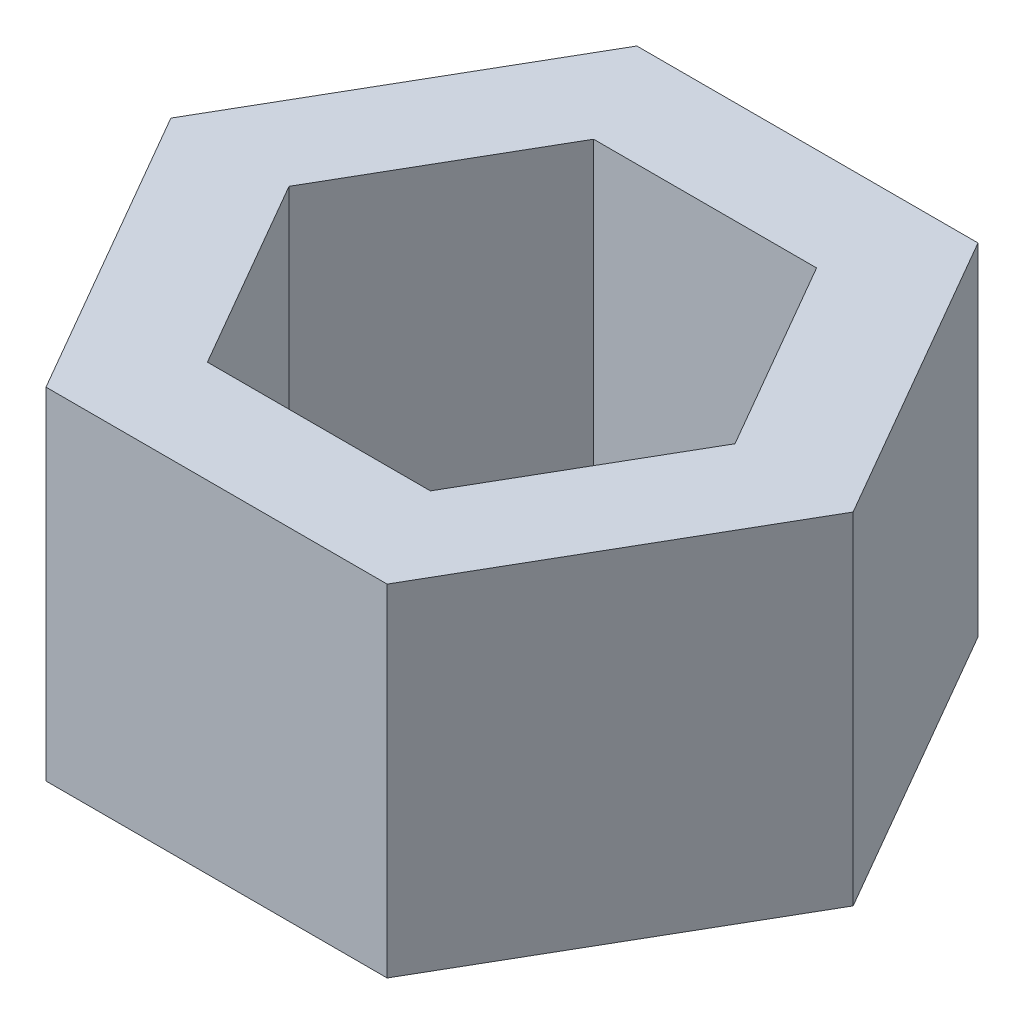
ISO-10303-21;
HEADER;
FILE_DESCRIPTION(('STEP AP214'),'2;1');
FILE_NAME('part.step','',(''),(''),'','','');
FILE_SCHEMA(('AUTOMOTIVE_DESIGN { 1 0 10303 214 1 1 1 1 }'));
ENDSEC;
DATA;
#1=APPLICATION_CONTEXT('core data for automotive mechanical design processes');
#2=APPLICATION_PROTOCOL_DEFINITION('international standard','automotive_design',2000,#1);
#3=PRODUCT_CONTEXT('',#1,'mechanical');
#4=PRODUCT('Part','Part','',(#3));
#5=PRODUCT_RELATED_PRODUCT_CATEGORY('part','',(#4));
#6=PRODUCT_DEFINITION_FORMATION('','',#4);
#7=PRODUCT_DEFINITION_CONTEXT('part definition',#1,'design');
#8=PRODUCT_DEFINITION('design','',#6,#7);
#9=PRODUCT_DEFINITION_SHAPE('','',#8);
#10=(LENGTH_UNIT() NAMED_UNIT(*) SI_UNIT(.MILLI.,.METRE.));
#11=(NAMED_UNIT(*) PLANE_ANGLE_UNIT() SI_UNIT($,.RADIAN.));
#12=(NAMED_UNIT(*) SI_UNIT($,.STERADIAN.) SOLID_ANGLE_UNIT());
#13=UNCERTAINTY_MEASURE_WITH_UNIT(LENGTH_MEASURE(1.E-05),#10,'distance_accuracy_value','');
#14=(GEOMETRIC_REPRESENTATION_CONTEXT(3) GLOBAL_UNCERTAINTY_ASSIGNED_CONTEXT((#13)) GLOBAL_UNIT_ASSIGNED_CONTEXT((#10,
#11,#12)) REPRESENTATION_CONTEXT('',''));
#15=CARTESIAN_POINT('',(0.,0.,0.));
#16=DIRECTION('',(0.,0.,1.));
#17=DIRECTION('',(1.,0.,0.));
#18=AXIS2_PLACEMENT_3D('',#15,#16,#17);
#19=CARTESIAN_POINT('',(-50.,50.,0.));
#20=DIRECTION('',(0.866025403784438,0.,-0.5));
#21=DIRECTION('',(-0.5,0.,-0.866025403784439));
#22=AXIS2_PLACEMENT_3D('',#19,#20,#21);
#23=PLANE('',#22);
#24=DIRECTION('',(0.5,0.,0.866025403784438));
#25=VECTOR('',#24,1.);
#26=CARTESIAN_POINT('',(-50.,0.,0.));
#27=LINE('',#26,#25);
#28=CARTESIAN_POINT('',(-50.,0.,0.));
#29=VERTEX_POINT('',#28);
#30=CARTESIAN_POINT('',(-25.,0.,43.3012701892219));
#31=VERTEX_POINT('',#30);
#32=EDGE_CURVE('E167',#29,#31,#27,.T.);
#33=ORIENTED_EDGE('',*,*,#32,.T.);
#34=DIRECTION('',(0.,-1.,0.));
#35=VECTOR('',#34,1.);
#36=CARTESIAN_POINT('',(-25.,50.,43.3012701892219));
#37=LINE('',#36,#35);
#38=CARTESIAN_POINT('',(-25.,50.,43.3012701892219));
#39=VERTEX_POINT('',#38);
#40=EDGE_CURVE('E11',#39,#31,#37,.T.);
#41=ORIENTED_EDGE('',*,*,#40,.F.);
#42=DIRECTION('',(0.5,0.,0.866025403784438));
#43=VECTOR('',#42,1.);
#44=CARTESIAN_POINT('',(-50.,50.,0.));
#45=LINE('',#44,#43);
#46=CARTESIAN_POINT('',(-50.,50.,0.));
#47=VERTEX_POINT('',#46);
#48=EDGE_CURVE('E175',#47,#39,#45,.T.);
#49=ORIENTED_EDGE('',*,*,#48,.F.);
#50=DIRECTION('',(0.,-1.,0.));
#51=VECTOR('',#50,1.);
#52=CARTESIAN_POINT('',(-50.,50.,0.));
#53=LINE('',#52,#51);
#54=EDGE_CURVE('E189',#47,#29,#53,.T.);
#55=ORIENTED_EDGE('',*,*,#54,.T.);
#56=EDGE_LOOP('',(#33,#41,#49,#55));
#57=FACE_BOUND('',#56,.T.);
#58=ADVANCED_FACE('F34',(#57),#23,.F.);
#59=CARTESIAN_POINT('',(-25.,50.,43.3012701892219));
#60=DIRECTION('',(0.,0.,-1.));
#61=DIRECTION('',(-1.,0.,0.));
#62=AXIS2_PLACEMENT_3D('',#59,#60,#61);
#63=PLANE('',#62);
#64=DIRECTION('',(1.,0.,0.));
#65=VECTOR('',#64,1.);
#66=CARTESIAN_POINT('',(-25.,0.,43.3012701892219));
#67=LINE('',#66,#65);
#68=CARTESIAN_POINT('',(25.,0.,43.3012701892219));
#69=VERTEX_POINT('',#68);
#70=EDGE_CURVE('E192',#31,#69,#67,.T.);
#71=ORIENTED_EDGE('',*,*,#70,.T.);
#72=DIRECTION('',(0.,-1.,0.));
#73=VECTOR('',#72,1.);
#74=CARTESIAN_POINT('',(25.,50.,43.3012701892219));
#75=LINE('',#74,#73);
#76=CARTESIAN_POINT('',(25.,50.,43.3012701892219));
#77=VERTEX_POINT('',#76);
#78=EDGE_CURVE('E41',#77,#69,#75,.T.);
#79=ORIENTED_EDGE('',*,*,#78,.F.);
#80=DIRECTION('',(1.,0.,0.));
#81=VECTOR('',#80,1.);
#82=CARTESIAN_POINT('',(-25.,50.,43.3012701892219));
#83=LINE('',#82,#81);
#84=EDGE_CURVE('E178',#39,#77,#83,.T.);
#85=ORIENTED_EDGE('',*,*,#84,.F.);
#86=ORIENTED_EDGE('',*,*,#40,.T.);
#87=EDGE_LOOP('',(#71,#79,#85,#86));
#88=FACE_BOUND('',#87,.T.);
#89=ADVANCED_FACE('F237',(#88),#63,.F.);
#90=CARTESIAN_POINT('',(25.,50.,43.3012701892219));
#91=DIRECTION('',(-0.866025403784439,0.,-0.5));
#92=DIRECTION('',(-0.5,0.,0.866025403784439));
#93=AXIS2_PLACEMENT_3D('',#90,#91,#92);
#94=PLANE('',#93);
#95=DIRECTION('',(0.5,0.,-0.866025403784439));
#96=VECTOR('',#95,1.);
#97=CARTESIAN_POINT('',(25.,0.,43.3012701892219));
#98=LINE('',#97,#96);
#99=CARTESIAN_POINT('',(50.,0.,0.));
#100=VERTEX_POINT('',#99);
#101=EDGE_CURVE('E194',#69,#100,#98,.T.);
#102=ORIENTED_EDGE('',*,*,#101,.T.);
#103=DIRECTION('',(0.,-1.,0.));
#104=VECTOR('',#103,1.);
#105=CARTESIAN_POINT('',(50.,50.,0.));
#106=LINE('',#105,#104);
#107=CARTESIAN_POINT('',(50.,50.,0.));
#108=VERTEX_POINT('',#107);
#109=EDGE_CURVE('E209',#108,#100,#106,.T.);
#110=ORIENTED_EDGE('',*,*,#109,.F.);
#111=DIRECTION('',(0.5,0.,-0.866025403784439));
#112=VECTOR('',#111,1.);
#113=CARTESIAN_POINT('',(25.,50.,43.3012701892219));
#114=LINE('',#113,#112);
#115=EDGE_CURVE('E181',#77,#108,#114,.T.);
#116=ORIENTED_EDGE('',*,*,#115,.F.);
#117=ORIENTED_EDGE('',*,*,#78,.T.);
#118=EDGE_LOOP('',(#102,#110,#116,#117));
#119=FACE_BOUND('',#118,.T.);
#120=ADVANCED_FACE('F216',(#119),#94,.F.);
#121=CARTESIAN_POINT('',(50.,50.,0.));
#122=DIRECTION('',(-0.866025403784438,0.,0.5));
#123=DIRECTION('',(0.5,0.,0.866025403784439));
#124=AXIS2_PLACEMENT_3D('',#121,#122,#123);
#125=PLANE('',#124);
#126=DIRECTION('',(-0.5,0.,-0.866025403784438));
#127=VECTOR('',#126,1.);
#128=CARTESIAN_POINT('',(50.,0.,0.));
#129=LINE('',#128,#127);
#130=CARTESIAN_POINT('',(25.,0.,-43.3012701892219));
#131=VERTEX_POINT('',#130);
#132=EDGE_CURVE('E196',#100,#131,#129,.T.);
#133=ORIENTED_EDGE('',*,*,#132,.T.);
#134=DIRECTION('',(0.,-1.,0.));
#135=VECTOR('',#134,1.);
#136=CARTESIAN_POINT('',(25.,50.,-43.3012701892219));
#137=LINE('',#136,#135);
#138=CARTESIAN_POINT('',(25.,50.,-43.3012701892219));
#139=VERTEX_POINT('',#138);
#140=EDGE_CURVE('E206',#139,#131,#137,.T.);
#141=ORIENTED_EDGE('',*,*,#140,.F.);
#142=DIRECTION('',(-0.5,0.,-0.866025403784438));
#143=VECTOR('',#142,1.);
#144=CARTESIAN_POINT('',(50.,50.,0.));
#145=LINE('',#144,#143);
#146=EDGE_CURVE('E183',#108,#139,#145,.T.);
#147=ORIENTED_EDGE('',*,*,#146,.F.);
#148=ORIENTED_EDGE('',*,*,#109,.T.);
#149=EDGE_LOOP('',(#133,#141,#147,#148));
#150=FACE_BOUND('',#149,.T.);
#151=ADVANCED_FACE('F225',(#150),#125,.F.);
#152=CARTESIAN_POINT('',(25.,50.,-43.3012701892219));
#153=DIRECTION('',(0.,0.,1.));
#154=DIRECTION('',(1.,0.,0.));
#155=AXIS2_PLACEMENT_3D('',#152,#153,#154);
#156=PLANE('',#155);
#157=DIRECTION('',(-1.,0.,0.));
#158=VECTOR('',#157,1.);
#159=CARTESIAN_POINT('',(25.,0.,-43.3012701892219));
#160=LINE('',#159,#158);
#161=CARTESIAN_POINT('',(-25.,0.,-43.3012701892219));
#162=VERTEX_POINT('',#161);
#163=EDGE_CURVE('E198',#131,#162,#160,.T.);
#164=ORIENTED_EDGE('',*,*,#163,.T.);
#165=DIRECTION('',(0.,-1.,0.));
#166=VECTOR('',#165,1.);
#167=CARTESIAN_POINT('',(-25.,50.,-43.3012701892219));
#168=LINE('',#167,#166);
#169=CARTESIAN_POINT('',(-25.,50.,-43.3012701892219));
#170=VERTEX_POINT('',#169);
#171=EDGE_CURVE('E203',#170,#162,#168,.T.);
#172=ORIENTED_EDGE('',*,*,#171,.F.);
#173=DIRECTION('',(-1.,0.,0.));
#174=VECTOR('',#173,1.);
#175=CARTESIAN_POINT('',(25.,50.,-43.3012701892219));
#176=LINE('',#175,#174);
#177=EDGE_CURVE('E185',#139,#170,#176,.T.);
#178=ORIENTED_EDGE('',*,*,#177,.F.);
#179=ORIENTED_EDGE('',*,*,#140,.T.);
#180=EDGE_LOOP('',(#164,#172,#178,#179));
#181=FACE_BOUND('',#180,.T.);
#182=ADVANCED_FACE('F229',(#181),#156,.F.);
#183=CARTESIAN_POINT('',(-25.,50.,-43.3012701892219));
#184=DIRECTION('',(0.866025403784439,0.,0.5));
#185=DIRECTION('',(0.5,0.,-0.866025403784439));
#186=AXIS2_PLACEMENT_3D('',#183,#184,#185);
#187=PLANE('',#186);
#188=DIRECTION('',(-0.5,0.,0.866025403784439));
#189=VECTOR('',#188,1.);
#190=CARTESIAN_POINT('',(-25.,0.,-43.3012701892219));
#191=LINE('',#190,#189);
#192=EDGE_CURVE('E179',#162,#29,#191,.T.);
#193=ORIENTED_EDGE('',*,*,#192,.T.);
#194=ORIENTED_EDGE('',*,*,#54,.F.);
#195=DIRECTION('',(-0.5,0.,0.866025403784439));
#196=VECTOR('',#195,1.);
#197=CARTESIAN_POINT('',(-25.,50.,-43.3012701892219));
#198=LINE('',#197,#196);
#199=EDGE_CURVE('E187',#170,#47,#198,.T.);
#200=ORIENTED_EDGE('',*,*,#199,.F.);
#201=ORIENTED_EDGE('',*,*,#171,.T.);
#202=EDGE_LOOP('',(#193,#194,#200,#201));
#203=FACE_BOUND('',#202,.T.);
#204=ADVANCED_FACE('F240',(#203),#187,.F.);
#205=CARTESIAN_POINT('',(0.,50.,0.));
#206=DIRECTION('',(0.,1.,0.));
#207=DIRECTION('',(0.,0.,1.));
#208=AXIS2_PLACEMENT_3D('',#205,#206,#207);
#209=PLANE('',#208);
#210=DIRECTION('',(-0.5,0.,0.866025403784439));
#211=VECTOR('',#210,1.);
#212=CARTESIAN_POINT('',(-16.3397459621556,50.,-28.3012701892219));
#213=LINE('',#212,#211);
#214=CARTESIAN_POINT('',(-16.3397459621556,50.,-28.3012701892219));
#215=VERTEX_POINT('',#214);
#216=CARTESIAN_POINT('',(-32.6794919243112,50.,0.));
#217=VERTEX_POINT('',#216);
#218=EDGE_CURVE('E48',#215,#217,#213,.T.);
#219=ORIENTED_EDGE('',*,*,#218,.F.);
#220=DIRECTION('',(-1.,0.,0.));
#221=VECTOR('',#220,1.);
#222=CARTESIAN_POINT('',(16.3397459621556,50.,-28.3012701892219));
#223=LINE('',#222,#221);
#224=CARTESIAN_POINT('',(16.3397459621556,50.,-28.3012701892219));
#225=VERTEX_POINT('',#224);
#226=EDGE_CURVE('E141',#225,#215,#223,.T.);
#227=ORIENTED_EDGE('',*,*,#226,.F.);
#228=DIRECTION('',(-0.5,0.,-0.866025403784438));
#229=VECTOR('',#228,1.);
#230=CARTESIAN_POINT('',(32.6794919243112,50.,0.));
#231=LINE('',#230,#229);
#232=CARTESIAN_POINT('',(32.6794919243112,50.,0.));
#233=VERTEX_POINT('',#232);
#234=EDGE_CURVE('E144',#233,#225,#231,.T.);
#235=ORIENTED_EDGE('',*,*,#234,.F.);
#236=DIRECTION('',(0.5,0.,-0.866025403784439));
#237=VECTOR('',#236,1.);
#238=CARTESIAN_POINT('',(16.3397459621556,50.,28.3012701892219));
#239=LINE('',#238,#237);
#240=CARTESIAN_POINT('',(16.3397459621556,50.,28.3012701892219));
#241=VERTEX_POINT('',#240);
#242=EDGE_CURVE('E160',#241,#233,#239,.T.);
#243=ORIENTED_EDGE('',*,*,#242,.F.);
#244=DIRECTION('',(1.,0.,0.));
#245=VECTOR('',#244,1.);
#246=CARTESIAN_POINT('',(-16.3397459621556,50.,28.3012701892219));
#247=LINE('',#246,#245);
#248=CARTESIAN_POINT('',(-16.3397459621556,50.,28.3012701892219));
#249=VERTEX_POINT('',#248);
#250=EDGE_CURVE('E157',#249,#241,#247,.T.);
#251=ORIENTED_EDGE('',*,*,#250,.F.);
#252=DIRECTION('',(0.5,0.,0.866025403784439));
#253=VECTOR('',#252,1.);
#254=CARTESIAN_POINT('',(-32.6794919243112,50.,0.));
#255=LINE('',#254,#253);
#256=EDGE_CURVE('E155',#217,#249,#255,.T.);
#257=ORIENTED_EDGE('',*,*,#256,.F.);
#258=EDGE_LOOP('',(#219,#227,#235,#243,#251,#257));
#259=FACE_BOUND('',#258,.T.);
#260=ORIENTED_EDGE('',*,*,#48,.T.);
#261=ORIENTED_EDGE('',*,*,#84,.T.);
#262=ORIENTED_EDGE('',*,*,#115,.T.);
#263=ORIENTED_EDGE('',*,*,#146,.T.);
#264=ORIENTED_EDGE('',*,*,#177,.T.);
#265=ORIENTED_EDGE('',*,*,#199,.T.);
#266=EDGE_LOOP('',(#260,#261,#262,#263,#264,#265));
#267=FACE_BOUND('',#266,.T.);
#268=ADVANCED_FACE('F233',(#259,#267),#209,.T.);
#269=CARTESIAN_POINT('',(0.,0.,0.));
#270=DIRECTION('',(0.,1.,0.));
#271=DIRECTION('',(0.,0.,1.));
#272=AXIS2_PLACEMENT_3D('',#269,#270,#271);
#273=PLANE('',#272);
#274=DIRECTION('',(-1.,0.,0.));
#275=VECTOR('',#274,1.);
#276=CARTESIAN_POINT('',(16.3397459621556,0.,-28.3012701892219));
#277=LINE('',#276,#275);
#278=CARTESIAN_POINT('',(16.3397459621556,0.,-28.3012701892219));
#279=VERTEX_POINT('',#278);
#280=CARTESIAN_POINT('',(-16.3397459621556,0.,-28.3012701892219));
#281=VERTEX_POINT('',#280);
#282=EDGE_CURVE('E130',#279,#281,#277,.T.);
#283=ORIENTED_EDGE('',*,*,#282,.T.);
#284=DIRECTION('',(-0.5,0.,0.866025403784439));
#285=VECTOR('',#284,1.);
#286=CARTESIAN_POINT('',(-16.3397459621556,0.,-28.3012701892219));
#287=LINE('',#286,#285);
#288=CARTESIAN_POINT('',(-32.6794919243112,0.,0.));
#289=VERTEX_POINT('',#288);
#290=EDGE_CURVE('E124',#281,#289,#287,.T.);
#291=ORIENTED_EDGE('',*,*,#290,.T.);
#292=DIRECTION('',(0.5,0.,0.866025403784439));
#293=VECTOR('',#292,1.);
#294=CARTESIAN_POINT('',(-32.6794919243112,0.,0.));
#295=LINE('',#294,#293);
#296=CARTESIAN_POINT('',(-16.3397459621556,0.,28.3012701892219));
#297=VERTEX_POINT('',#296);
#298=EDGE_CURVE('E133',#289,#297,#295,.T.);
#299=ORIENTED_EDGE('',*,*,#298,.T.);
#300=DIRECTION('',(1.,0.,0.));
#301=VECTOR('',#300,1.);
#302=CARTESIAN_POINT('',(-16.3397459621556,0.,28.3012701892219));
#303=LINE('',#302,#301);
#304=CARTESIAN_POINT('',(16.3397459621556,0.,28.3012701892219));
#305=VERTEX_POINT('',#304);
#306=EDGE_CURVE('E56',#297,#305,#303,.T.);
#307=ORIENTED_EDGE('',*,*,#306,.T.);
#308=DIRECTION('',(0.5,0.,-0.866025403784439));
#309=VECTOR('',#308,1.);
#310=CARTESIAN_POINT('',(16.3397459621556,0.,28.3012701892219));
#311=LINE('',#310,#309);
#312=CARTESIAN_POINT('',(32.6794919243112,0.,0.));
#313=VERTEX_POINT('',#312);
#314=EDGE_CURVE('E148',#305,#313,#311,.T.);
#315=ORIENTED_EDGE('',*,*,#314,.T.);
#316=DIRECTION('',(-0.5,0.,-0.866025403784438));
#317=VECTOR('',#316,1.);
#318=CARTESIAN_POINT('',(32.6794919243112,0.,0.));
#319=LINE('',#318,#317);
#320=EDGE_CURVE('E151',#313,#279,#319,.T.);
#321=ORIENTED_EDGE('',*,*,#320,.T.);
#322=EDGE_LOOP('',(#283,#291,#299,#307,#315,#321));
#323=FACE_BOUND('',#322,.T.);
#324=ORIENTED_EDGE('',*,*,#32,.F.);
#325=ORIENTED_EDGE('',*,*,#192,.F.);
#326=ORIENTED_EDGE('',*,*,#163,.F.);
#327=ORIENTED_EDGE('',*,*,#132,.F.);
#328=ORIENTED_EDGE('',*,*,#101,.F.);
#329=ORIENTED_EDGE('',*,*,#70,.F.);
#330=EDGE_LOOP('',(#324,#325,#326,#327,#328,#329));
#331=FACE_BOUND('',#330,.T.);
#332=ADVANCED_FACE('F137',(#323,#331),#273,.F.);
#333=CARTESIAN_POINT('',(-16.3397459621556,0.,-28.3012701892219));
#334=DIRECTION('',(-0.866025403784439,0.,-0.5));
#335=DIRECTION('',(-0.5,0.,0.866025403784439));
#336=AXIS2_PLACEMENT_3D('',#333,#334,#335);
#337=PLANE('',#336);
#338=ORIENTED_EDGE('',*,*,#218,.T.);
#339=DIRECTION('',(0.,1.,0.));
#340=VECTOR('',#339,1.);
#341=CARTESIAN_POINT('',(-32.6794919243112,0.,0.));
#342=LINE('',#341,#340);
#343=EDGE_CURVE('E120',#289,#217,#342,.T.);
#344=ORIENTED_EDGE('',*,*,#343,.F.);
#345=ORIENTED_EDGE('',*,*,#290,.F.);
#346=DIRECTION('',(0.,1.,0.));
#347=VECTOR('',#346,1.);
#348=CARTESIAN_POINT('',(-16.3397459621556,0.,-28.3012701892219));
#349=LINE('',#348,#347);
#350=EDGE_CURVE('E165',#281,#215,#349,.T.);
#351=ORIENTED_EDGE('',*,*,#350,.T.);
#352=EDGE_LOOP('',(#338,#344,#345,#351));
#353=FACE_BOUND('',#352,.T.);
#354=ADVANCED_FACE('F122',(#353),#337,.F.);
#355=CARTESIAN_POINT('',(16.3397459621556,0.,-28.3012701892219));
#356=DIRECTION('',(0.,0.,-1.));
#357=DIRECTION('',(-1.,0.,0.));
#358=AXIS2_PLACEMENT_3D('',#355,#356,#357);
#359=PLANE('',#358);
#360=ORIENTED_EDGE('',*,*,#226,.T.);
#361=ORIENTED_EDGE('',*,*,#350,.F.);
#362=ORIENTED_EDGE('',*,*,#282,.F.);
#363=DIRECTION('',(0.,1.,0.));
#364=VECTOR('',#363,1.);
#365=CARTESIAN_POINT('',(16.3397459621556,0.,-28.3012701892219));
#366=LINE('',#365,#364);
#367=EDGE_CURVE('E168',#279,#225,#366,.T.);
#368=ORIENTED_EDGE('',*,*,#367,.T.);
#369=EDGE_LOOP('',(#360,#361,#362,#368));
#370=FACE_BOUND('',#369,.T.);
#371=ADVANCED_FACE('F295',(#370),#359,.F.);
#372=CARTESIAN_POINT('',(32.6794919243112,0.,0.));
#373=DIRECTION('',(0.866025403784438,0.,-0.5));
#374=DIRECTION('',(-0.5,0.,-0.866025403784438));
#375=AXIS2_PLACEMENT_3D('',#372,#373,#374);
#376=PLANE('',#375);
#377=ORIENTED_EDGE('',*,*,#234,.T.);
#378=ORIENTED_EDGE('',*,*,#367,.F.);
#379=ORIENTED_EDGE('',*,*,#320,.F.);
#380=DIRECTION('',(0.,1.,0.));
#381=VECTOR('',#380,1.);
#382=CARTESIAN_POINT('',(32.6794919243112,0.,0.));
#383=LINE('',#382,#381);
#384=EDGE_CURVE('E170',#313,#233,#383,.T.);
#385=ORIENTED_EDGE('',*,*,#384,.T.);
#386=EDGE_LOOP('',(#377,#378,#379,#385));
#387=FACE_BOUND('',#386,.T.);
#388=ADVANCED_FACE('F304',(#387),#376,.F.);
#389=CARTESIAN_POINT('',(16.3397459621556,0.,28.3012701892219));
#390=DIRECTION('',(0.866025403784439,0.,0.5));
#391=DIRECTION('',(0.5,0.,-0.866025403784439));
#392=AXIS2_PLACEMENT_3D('',#389,#390,#391);
#393=PLANE('',#392);
#394=ORIENTED_EDGE('',*,*,#242,.T.);
#395=ORIENTED_EDGE('',*,*,#384,.F.);
#396=ORIENTED_EDGE('',*,*,#314,.F.);
#397=DIRECTION('',(0.,1.,0.));
#398=VECTOR('',#397,1.);
#399=CARTESIAN_POINT('',(16.3397459621556,0.,28.3012701892219));
#400=LINE('',#399,#398);
#401=EDGE_CURVE('E172',#305,#241,#400,.T.);
#402=ORIENTED_EDGE('',*,*,#401,.T.);
#403=EDGE_LOOP('',(#394,#395,#396,#402));
#404=FACE_BOUND('',#403,.T.);
#405=ADVANCED_FACE('F314',(#404),#393,.F.);
#406=CARTESIAN_POINT('',(-16.3397459621556,0.,28.3012701892219));
#407=DIRECTION('',(0.,0.,1.));
#408=DIRECTION('',(1.,0.,0.));
#409=AXIS2_PLACEMENT_3D('',#406,#407,#408);
#410=PLANE('',#409);
#411=ORIENTED_EDGE('',*,*,#250,.T.);
#412=ORIENTED_EDGE('',*,*,#401,.F.);
#413=ORIENTED_EDGE('',*,*,#306,.F.);
#414=DIRECTION('',(0.,1.,0.));
#415=VECTOR('',#414,1.);
#416=CARTESIAN_POINT('',(-16.3397459621556,0.,28.3012701892219));
#417=LINE('',#416,#415);
#418=EDGE_CURVE('E129',#297,#249,#417,.T.);
#419=ORIENTED_EDGE('',*,*,#418,.T.);
#420=EDGE_LOOP('',(#411,#412,#413,#419));
#421=FACE_BOUND('',#420,.T.);
#422=ADVANCED_FACE('F324',(#421),#410,.F.);
#423=CARTESIAN_POINT('',(-32.6794919243112,0.,0.));
#424=DIRECTION('',(-0.866025403784439,0.,0.5));
#425=DIRECTION('',(0.5,0.,0.866025403784439));
#426=AXIS2_PLACEMENT_3D('',#423,#424,#425);
#427=PLANE('',#426);
#428=ORIENTED_EDGE('',*,*,#256,.T.);
#429=ORIENTED_EDGE('',*,*,#418,.F.);
#430=ORIENTED_EDGE('',*,*,#298,.F.);
#431=ORIENTED_EDGE('',*,*,#343,.T.);
#432=EDGE_LOOP('',(#428,#429,#430,#431));
#433=FACE_BOUND('',#432,.T.);
#434=ADVANCED_FACE('F134',(#433),#427,.F.);
#435=CLOSED_SHELL('',(#58,#89,#120,#151,#182,#204,#268,#332,#354,#371,#388,#405,#422,#434));
#436=MANIFOLD_SOLID_BREP('B2',#435);
#437=ADVANCED_BREP_SHAPE_REPRESENTATION('',(#18,#436),#14);
#438=SHAPE_DEFINITION_REPRESENTATION(#9,#437);
ENDSEC;
END-ISO-10303-21;
